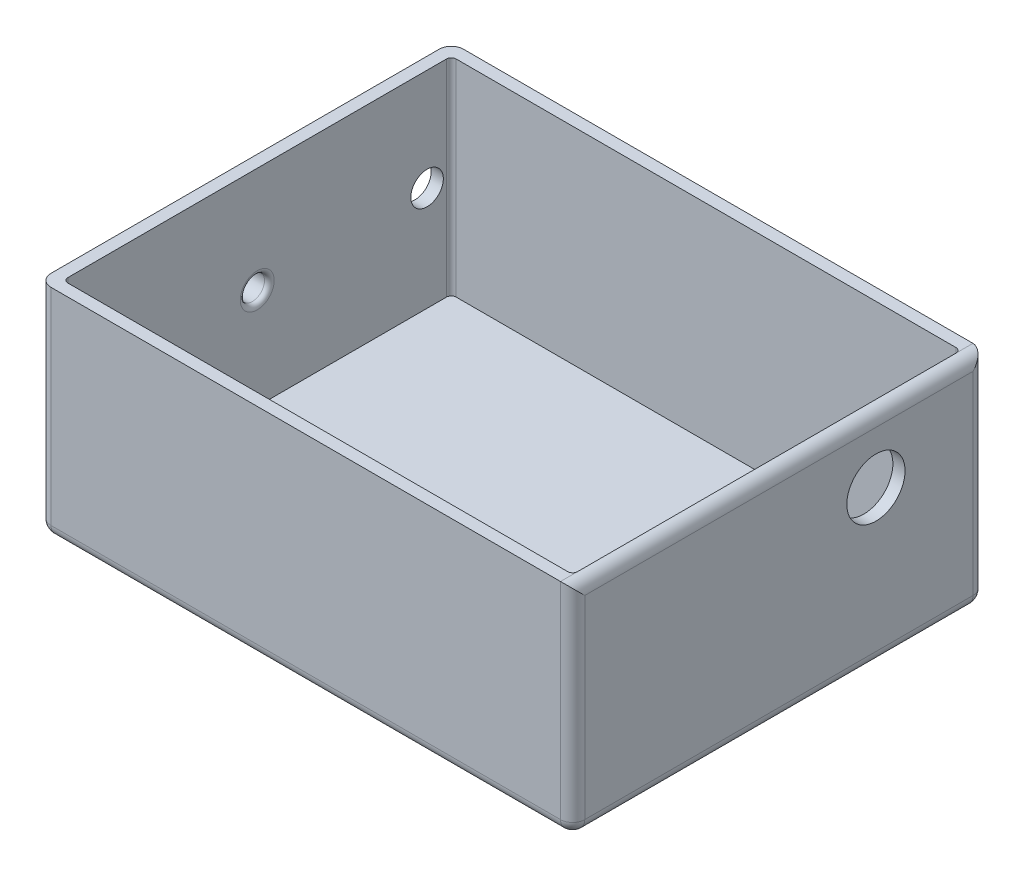
ISO-10303-21;
HEADER;
FILE_DESCRIPTION(('STEP AP214'),'2;1');
FILE_NAME('part.step','',(''),(''),'','','');
FILE_SCHEMA(('AUTOMOTIVE_DESIGN { 1 0 10303 214 1 1 1 1 }'));
ENDSEC;
DATA;
#1=APPLICATION_CONTEXT('core data for automotive mechanical design processes');
#2=APPLICATION_PROTOCOL_DEFINITION('international standard','automotive_design',2000,#1);
#3=PRODUCT_CONTEXT('',#1,'mechanical');
#4=PRODUCT('Part','Part','',(#3));
#5=PRODUCT_RELATED_PRODUCT_CATEGORY('part','',(#4));
#6=PRODUCT_DEFINITION_FORMATION('','',#4);
#7=PRODUCT_DEFINITION_CONTEXT('part definition',#1,'design');
#8=PRODUCT_DEFINITION('design','',#6,#7);
#9=PRODUCT_DEFINITION_SHAPE('','',#8);
#10=(LENGTH_UNIT() NAMED_UNIT(*) SI_UNIT(.MILLI.,.METRE.));
#11=(NAMED_UNIT(*) PLANE_ANGLE_UNIT() SI_UNIT($,.RADIAN.));
#12=(NAMED_UNIT(*) SI_UNIT($,.STERADIAN.) SOLID_ANGLE_UNIT());
#13=UNCERTAINTY_MEASURE_WITH_UNIT(LENGTH_MEASURE(1.E-05),#10,'distance_accuracy_value','');
#14=(GEOMETRIC_REPRESENTATION_CONTEXT(3) GLOBAL_UNCERTAINTY_ASSIGNED_CONTEXT((#13)) GLOBAL_UNIT_ASSIGNED_CONTEXT((#10,
#11,#12)) REPRESENTATION_CONTEXT('',''));
#15=CARTESIAN_POINT('',(0.,0.,0.));
#16=DIRECTION('',(0.,0.,1.));
#17=DIRECTION('',(1.,0.,0.));
#18=AXIS2_PLACEMENT_3D('',#15,#16,#17);
#19=CARTESIAN_POINT('',(55.,45.,42.5));
#20=DIRECTION('',(-1.,0.,0.));
#21=DIRECTION('',(0.,0.,1.));
#22=AXIS2_PLACEMENT_3D('',#19,#20,#21);
#23=PLANE('',#22);
#24=CARTESIAN_POINT('',(55.,31.7655810524085,-20.));
#25=DIRECTION('',(1.,0.,0.));
#26=DIRECTION('',(0.,0.,-1.));
#27=AXIS2_PLACEMENT_3D('',#24,#25,#26);
#28=CIRCLE('',#27,6.);
#29=CARTESIAN_POINT('',(55.,31.7655810524085,-26.));
#30=VERTEX_POINT('',#29);
#31=EDGE_CURVE('E157',#30,#30,#28,.T.);
#32=ORIENTED_EDGE('',*,*,#31,.F.);
#33=EDGE_LOOP('',(#32));
#34=FACE_BOUND('',#33,.T.);
#35=DIRECTION('',(0.,0.,-1.));
#36=VECTOR('',#35,1.);
#37=CARTESIAN_POINT('',(55.,42.5,42.5));
#38=LINE('',#37,#36);
#39=CARTESIAN_POINT('',(55.,42.5,-40.));
#40=VERTEX_POINT('',#39);
#41=CARTESIAN_POINT('',(55.,42.5,40.));
#42=VERTEX_POINT('',#41);
#43=EDGE_CURVE('E205',#40,#42,#38,.F.);
#44=ORIENTED_EDGE('',*,*,#43,.T.);
#45=DIRECTION('',(0.,-1.,0.));
#46=VECTOR('',#45,1.);
#47=CARTESIAN_POINT('',(55.,45.,40.));
#48=LINE('',#47,#46);
#49=CARTESIAN_POINT('',(55.,2.5,40.));
#50=VERTEX_POINT('',#49);
#51=EDGE_CURVE('E208',#42,#50,#48,.T.);
#52=ORIENTED_EDGE('',*,*,#51,.T.);
#53=DIRECTION('',(0.,0.,-1.));
#54=VECTOR('',#53,1.);
#55=CARTESIAN_POINT('',(55.,2.5,-42.5));
#56=LINE('',#55,#54);
#57=CARTESIAN_POINT('',(55.,2.5,-40.));
#58=VERTEX_POINT('',#57);
#59=EDGE_CURVE('E199',#50,#58,#56,.T.);
#60=ORIENTED_EDGE('',*,*,#59,.T.);
#61=DIRECTION('',(0.,-1.,0.));
#62=VECTOR('',#61,1.);
#63=CARTESIAN_POINT('',(55.,45.,-40.));
#64=LINE('',#63,#62);
#65=EDGE_CURVE('E202',#58,#40,#64,.F.);
#66=ORIENTED_EDGE('',*,*,#65,.T.);
#67=EDGE_LOOP('',(#44,#52,#60,#66));
#68=FACE_BOUND('',#67,.T.);
#69=ADVANCED_FACE('F36',(#34,#68),#23,.F.);
#70=CARTESIAN_POINT('',(-55.,45.,-42.5));
#71=DIRECTION('',(0.,0.,1.));
#72=DIRECTION('',(1.,0.,0.));
#73=AXIS2_PLACEMENT_3D('',#70,#71,#72);
#74=PLANE('',#73);
#75=DIRECTION('',(-1.,0.,0.));
#76=VECTOR('',#75,1.);
#77=CARTESIAN_POINT('',(-55.,45.,-42.5));
#78=LINE('',#77,#76);
#79=CARTESIAN_POINT('',(52.5,45.,-42.5));
#80=VERTEX_POINT('',#79);
#81=CARTESIAN_POINT('',(-52.5,45.,-42.5));
#82=VERTEX_POINT('',#81);
#83=EDGE_CURVE('E186',#80,#82,#78,.T.);
#84=ORIENTED_EDGE('',*,*,#83,.F.);
#85=DIRECTION('',(0.,-1.,0.));
#86=VECTOR('',#85,1.);
#87=CARTESIAN_POINT('',(52.5,45.,-42.5));
#88=LINE('',#87,#86);
#89=CARTESIAN_POINT('',(52.5,2.5,-42.5));
#90=VERTEX_POINT('',#89);
#91=EDGE_CURVE('E234',#80,#90,#88,.T.);
#92=ORIENTED_EDGE('',*,*,#91,.T.);
#93=DIRECTION('',(-1.,0.,0.));
#94=VECTOR('',#93,1.);
#95=CARTESIAN_POINT('',(-55.,2.5,-42.5));
#96=LINE('',#95,#94);
#97=CARTESIAN_POINT('',(-52.5,2.5,-42.5));
#98=VERTEX_POINT('',#97);
#99=EDGE_CURVE('E231',#90,#98,#96,.T.);
#100=ORIENTED_EDGE('',*,*,#99,.T.);
#101=DIRECTION('',(0.,-1.,0.));
#102=VECTOR('',#101,1.);
#103=CARTESIAN_POINT('',(-52.5,45.,-42.5));
#104=LINE('',#103,#102);
#105=EDGE_CURVE('E228',#98,#82,#104,.F.);
#106=ORIENTED_EDGE('',*,*,#105,.T.);
#107=EDGE_LOOP('',(#84,#92,#100,#106));
#108=FACE_BOUND('',#107,.T.);
#109=ADVANCED_FACE('F333',(#108),#74,.F.);
#110=CARTESIAN_POINT('',(-55.,45.,42.5));
#111=DIRECTION('',(1.,0.,0.));
#112=DIRECTION('',(0.,0.,-1.));
#113=AXIS2_PLACEMENT_3D('',#110,#111,#112);
#114=PLANE('',#113);
#115=CARTESIAN_POINT('',(-55.,23.9646390651741,-35.));
#116=DIRECTION('',(-1.,0.,0.));
#117=DIRECTION('',(0.,0.,1.));
#118=AXIS2_PLACEMENT_3D('',#115,#116,#117);
#119=CIRCLE('',#118,3.35);
#120=CARTESIAN_POINT('',(-55.,23.9646390651741,-31.65));
#121=VERTEX_POINT('',#120);
#122=EDGE_CURVE('E166',#121,#121,#119,.T.);
#123=ORIENTED_EDGE('',*,*,#122,.F.);
#124=EDGE_LOOP('',(#123));
#125=FACE_BOUND('',#124,.T.);
#126=CARTESIAN_POINT('',(-55.,23.219153855166,0.));
#127=DIRECTION('',(1.,0.,0.));
#128=DIRECTION('',(0.,0.,-1.));
#129=AXIS2_PLACEMENT_3D('',#126,#127,#128);
#130=CIRCLE('',#129,5.9150635094611);
#131=CARTESIAN_POINT('',(-55.,23.219153855166,-5.9150635094611));
#132=VERTEX_POINT('',#131);
#133=EDGE_CURVE('E258',#132,#132,#130,.T.);
#134=ORIENTED_EDGE('',*,*,#133,.T.);
#135=EDGE_LOOP('',(#134));
#136=FACE_BOUND('',#135,.T.);
#137=DIRECTION('',(0.,0.,1.));
#138=VECTOR('',#137,1.);
#139=CARTESIAN_POINT('',(-55.,45.,42.5));
#140=LINE('',#139,#138);
#141=CARTESIAN_POINT('',(-55.,45.,-40.));
#142=VERTEX_POINT('',#141);
#143=CARTESIAN_POINT('',(-55.,45.,40.));
#144=VERTEX_POINT('',#143);
#145=EDGE_CURVE('E194',#142,#144,#140,.T.);
#146=ORIENTED_EDGE('',*,*,#145,.F.);
#147=DIRECTION('',(0.,-1.,0.));
#148=VECTOR('',#147,1.);
#149=CARTESIAN_POINT('',(-55.,45.,-40.));
#150=LINE('',#149,#148);
#151=CARTESIAN_POINT('',(-55.,2.5,-40.));
#152=VERTEX_POINT('',#151);
#153=EDGE_CURVE('E255',#142,#152,#150,.T.);
#154=ORIENTED_EDGE('',*,*,#153,.T.);
#155=DIRECTION('',(0.,0.,1.));
#156=VECTOR('',#155,1.);
#157=CARTESIAN_POINT('',(-55.,2.5,42.5));
#158=LINE('',#157,#156);
#159=CARTESIAN_POINT('',(-55.,2.5,40.));
#160=VERTEX_POINT('',#159);
#161=EDGE_CURVE('E252',#152,#160,#158,.T.);
#162=ORIENTED_EDGE('',*,*,#161,.T.);
#163=DIRECTION('',(0.,-1.,0.));
#164=VECTOR('',#163,1.);
#165=CARTESIAN_POINT('',(-55.,45.,40.));
#166=LINE('',#165,#164);
#167=EDGE_CURVE('E249',#160,#144,#166,.F.);
#168=ORIENTED_EDGE('',*,*,#167,.T.);
#169=EDGE_LOOP('',(#146,#154,#162,#168));
#170=FACE_BOUND('',#169,.T.);
#171=ADVANCED_FACE('F383',(#125,#136,#170),#114,.F.);
#172=CARTESIAN_POINT('',(-55.,45.,42.5));
#173=DIRECTION('',(0.,0.,-1.));
#174=DIRECTION('',(-1.,0.,0.));
#175=AXIS2_PLACEMENT_3D('',#172,#173,#174);
#176=PLANE('',#175);
#177=DIRECTION('',(1.,0.,0.));
#178=VECTOR('',#177,1.);
#179=CARTESIAN_POINT('',(55.,2.5,42.5));
#180=LINE('',#179,#178);
#181=CARTESIAN_POINT('',(-52.5,2.5,42.5));
#182=VERTEX_POINT('',#181);
#183=CARTESIAN_POINT('',(52.5,2.5,42.5));
#184=VERTEX_POINT('',#183);
#185=EDGE_CURVE('E214',#182,#184,#180,.T.);
#186=ORIENTED_EDGE('',*,*,#185,.T.);
#187=DIRECTION('',(0.,-1.,0.));
#188=VECTOR('',#187,1.);
#189=CARTESIAN_POINT('',(52.5,45.,42.5));
#190=LINE('',#189,#188);
#191=CARTESIAN_POINT('',(52.5,45.,42.5));
#192=VERTEX_POINT('',#191);
#193=EDGE_CURVE('E217',#184,#192,#190,.F.);
#194=ORIENTED_EDGE('',*,*,#193,.T.);
#195=DIRECTION('',(1.,0.,0.));
#196=VECTOR('',#195,1.);
#197=CARTESIAN_POINT('',(-55.,45.,42.5));
#198=LINE('',#197,#196);
#199=CARTESIAN_POINT('',(-52.5,45.,42.5));
#200=VERTEX_POINT('',#199);
#201=EDGE_CURVE('E197',#200,#192,#198,.T.);
#202=ORIENTED_EDGE('',*,*,#201,.F.);
#203=DIRECTION('',(0.,-1.,0.));
#204=VECTOR('',#203,1.);
#205=CARTESIAN_POINT('',(-52.5,45.,42.5));
#206=LINE('',#205,#204);
#207=EDGE_CURVE('E211',#200,#182,#206,.T.);
#208=ORIENTED_EDGE('',*,*,#207,.T.);
#209=EDGE_LOOP('',(#186,#194,#202,#208));
#210=FACE_BOUND('',#209,.T.);
#211=ADVANCED_FACE('F408',(#210),#176,.F.);
#212=CARTESIAN_POINT('',(0.,45.,0.));
#213=DIRECTION('',(0.,-1.,0.));
#214=DIRECTION('',(0.,0.,-1.));
#215=AXIS2_PLACEMENT_3D('',#212,#213,#214);
#216=PLANE('',#215);
#217=ORIENTED_EDGE('',*,*,#201,.T.);
#218=DIRECTION('',(0.,0.,-1.));
#219=VECTOR('',#218,1.);
#220=CARTESIAN_POINT('',(52.5,45.,0.));
#221=LINE('',#220,#219);
#222=CARTESIAN_POINT('',(52.5,45.,39.));
#223=VERTEX_POINT('',#222);
#224=EDGE_CURVE('E74',#192,#223,#221,.T.);
#225=ORIENTED_EDGE('',*,*,#224,.T.);
#226=CARTESIAN_POINT('',(51.5,45.,39.));
#227=DIRECTION('',(0.,-1.,0.));
#228=DIRECTION('',(0.,0.,-1.));
#229=AXIS2_PLACEMENT_3D('',#226,#227,#228);
#230=CIRCLE('',#229,1.);
#231=CARTESIAN_POINT('',(51.5,45.,40.));
#232=VERTEX_POINT('',#231);
#233=EDGE_CURVE('E150',#223,#232,#230,.T.);
#234=ORIENTED_EDGE('',*,*,#233,.T.);
#235=DIRECTION('',(1.,0.,0.));
#236=VECTOR('',#235,1.);
#237=CARTESIAN_POINT('',(-52.5,45.,40.));
#238=LINE('',#237,#236);
#239=CARTESIAN_POINT('',(-51.5,45.,40.));
#240=VERTEX_POINT('',#239);
#241=EDGE_CURVE('E178',#240,#232,#238,.T.);
#242=ORIENTED_EDGE('',*,*,#241,.F.);
#243=CARTESIAN_POINT('',(-51.5,45.,39.));
#244=DIRECTION('',(0.,-1.,0.));
#245=DIRECTION('',(0.,0.,-1.));
#246=AXIS2_PLACEMENT_3D('',#243,#244,#245);
#247=CIRCLE('',#246,1.);
#248=CARTESIAN_POINT('',(-52.5,45.,39.));
#249=VERTEX_POINT('',#248);
#250=EDGE_CURVE('E45',#240,#249,#247,.T.);
#251=ORIENTED_EDGE('',*,*,#250,.T.);
#252=DIRECTION('',(0.,0.,1.));
#253=VECTOR('',#252,1.);
#254=CARTESIAN_POINT('',(-52.5,45.,40.));
#255=LINE('',#254,#253);
#256=CARTESIAN_POINT('',(-52.5,45.,-39.));
#257=VERTEX_POINT('',#256);
#258=EDGE_CURVE('E122',#257,#249,#255,.T.);
#259=ORIENTED_EDGE('',*,*,#258,.F.);
#260=CARTESIAN_POINT('',(-51.5,45.,-39.));
#261=DIRECTION('',(0.,-1.,0.));
#262=DIRECTION('',(0.,0.,-1.));
#263=AXIS2_PLACEMENT_3D('',#260,#261,#262);
#264=CIRCLE('',#263,1.);
#265=CARTESIAN_POINT('',(-51.5,45.,-40.));
#266=VERTEX_POINT('',#265);
#267=EDGE_CURVE('E11',#257,#266,#264,.T.);
#268=ORIENTED_EDGE('',*,*,#267,.T.);
#269=DIRECTION('',(-1.,0.,0.));
#270=VECTOR('',#269,1.);
#271=CARTESIAN_POINT('',(-52.5,45.,-40.));
#272=LINE('',#271,#270);
#273=CARTESIAN_POINT('',(51.5,45.,-40.));
#274=VERTEX_POINT('',#273);
#275=EDGE_CURVE('E121',#274,#266,#272,.T.);
#276=ORIENTED_EDGE('',*,*,#275,.F.);
#277=CARTESIAN_POINT('',(51.5,45.,-39.));
#278=DIRECTION('',(0.,-1.,0.));
#279=DIRECTION('',(0.,0.,-1.));
#280=AXIS2_PLACEMENT_3D('',#277,#278,#279);
#281=CIRCLE('',#280,1.);
#282=CARTESIAN_POINT('',(52.5,45.,-39.));
#283=VERTEX_POINT('',#282);
#284=EDGE_CURVE('E152',#274,#283,#281,.T.);
#285=ORIENTED_EDGE('',*,*,#284,.T.);
#286=DIRECTION('',(0.,0.,-1.));
#287=VECTOR('',#286,1.);
#288=CARTESIAN_POINT('',(52.5,45.,0.));
#289=LINE('',#288,#287);
#290=EDGE_CURVE('E53',#283,#80,#289,.T.);
#291=ORIENTED_EDGE('',*,*,#290,.T.);
#292=ORIENTED_EDGE('',*,*,#83,.T.);
#293=CARTESIAN_POINT('',(-52.5,45.,-40.));
#294=DIRECTION('',(0.,-1.,0.));
#295=DIRECTION('',(0.,0.,-1.));
#296=AXIS2_PLACEMENT_3D('',#293,#294,#295);
#297=CIRCLE('',#296,2.5);
#298=EDGE_CURVE('E223',#82,#142,#297,.F.);
#299=ORIENTED_EDGE('',*,*,#298,.T.);
#300=ORIENTED_EDGE('',*,*,#145,.T.);
#301=CARTESIAN_POINT('',(-52.5,45.,40.));
#302=DIRECTION('',(0.,-1.,0.));
#303=DIRECTION('',(0.,0.,-1.));
#304=AXIS2_PLACEMENT_3D('',#301,#302,#303);
#305=CIRCLE('',#304,2.5);
#306=EDGE_CURVE('E220',#144,#200,#305,.F.);
#307=ORIENTED_EDGE('',*,*,#306,.T.);
#308=EDGE_LOOP('',(#217,#225,#234,#242,#251,#259,#268,#276,#285,#291,#292,#299,#300,#307));
#309=FACE_BOUND('',#308,.T.);
#310=ADVANCED_FACE('F119',(#309),#216,.F.);
#311=CARTESIAN_POINT('',(0.,0.,0.));
#312=DIRECTION('',(0.,-1.,0.));
#313=DIRECTION('',(0.,0.,-1.));
#314=AXIS2_PLACEMENT_3D('',#311,#312,#313);
#315=PLANE('',#314);
#316=DIRECTION('',(0.,0.,1.));
#317=VECTOR('',#316,1.);
#318=CARTESIAN_POINT('',(-52.5,0.,-42.5));
#319=LINE('',#318,#317);
#320=CARTESIAN_POINT('',(-52.5,0.,40.));
#321=VERTEX_POINT('',#320);
#322=CARTESIAN_POINT('',(-52.5,0.,-40.));
#323=VERTEX_POINT('',#322);
#324=EDGE_CURVE('E240',#321,#323,#319,.F.);
#325=ORIENTED_EDGE('',*,*,#324,.T.);
#326=DIRECTION('',(-1.,0.,0.));
#327=VECTOR('',#326,1.);
#328=CARTESIAN_POINT('',(55.,0.,-40.));
#329=LINE('',#328,#327);
#330=CARTESIAN_POINT('',(52.5,0.,-40.));
#331=VERTEX_POINT('',#330);
#332=EDGE_CURVE('E246',#323,#331,#329,.F.);
#333=ORIENTED_EDGE('',*,*,#332,.T.);
#334=DIRECTION('',(0.,0.,-1.));
#335=VECTOR('',#334,1.);
#336=CARTESIAN_POINT('',(52.5,0.,42.5));
#337=LINE('',#336,#335);
#338=CARTESIAN_POINT('',(52.5,0.,40.));
#339=VERTEX_POINT('',#338);
#340=EDGE_CURVE('E243',#331,#339,#337,.F.);
#341=ORIENTED_EDGE('',*,*,#340,.T.);
#342=DIRECTION('',(1.,0.,0.));
#343=VECTOR('',#342,1.);
#344=CARTESIAN_POINT('',(-55.,0.,40.));
#345=LINE('',#344,#343);
#346=EDGE_CURVE('E237',#339,#321,#345,.F.);
#347=ORIENTED_EDGE('',*,*,#346,.T.);
#348=EDGE_LOOP('',(#325,#333,#341,#347));
#349=FACE_BOUND('',#348,.T.);
#350=ADVANCED_FACE('F430',(#349),#315,.T.);
#351=CARTESIAN_POINT('',(52.5,2.5,40.));
#352=DIRECTION('',(1.,0.,0.));
#353=DIRECTION('',(0.,0.,-1.));
#354=AXIS2_PLACEMENT_3D('',#351,#352,#353);
#355=PLANE('',#354);
#356=CARTESIAN_POINT('',(52.5,31.7655810524085,-20.));
#357=DIRECTION('',(1.,0.,0.));
#358=DIRECTION('',(0.,0.,-1.));
#359=AXIS2_PLACEMENT_3D('',#356,#357,#358);
#360=CIRCLE('',#359,6.);
#361=CARTESIAN_POINT('',(52.5,31.7655810524085,-26.));
#362=VERTEX_POINT('',#361);
#363=EDGE_CURVE('E154',#362,#362,#360,.T.);
#364=ORIENTED_EDGE('',*,*,#363,.T.);
#365=EDGE_LOOP('',(#364));
#366=FACE_BOUND('',#365,.T.);
#367=DIRECTION('',(0.,0.,-1.));
#368=VECTOR('',#367,1.);
#369=CARTESIAN_POINT('',(52.5,2.5,40.));
#370=LINE('',#369,#368);
#371=CARTESIAN_POINT('',(52.5,2.5,39.));
#372=VERTEX_POINT('',#371);
#373=CARTESIAN_POINT('',(52.5,2.5,-39.));
#374=VERTEX_POINT('',#373);
#375=EDGE_CURVE('E174',#372,#374,#370,.T.);
#376=ORIENTED_EDGE('',*,*,#375,.F.);
#377=DIRECTION('',(0.,1.,0.));
#378=VECTOR('',#377,1.);
#379=CARTESIAN_POINT('',(52.5,45.,39.));
#380=LINE('',#379,#378);
#381=EDGE_CURVE('E308',#372,#223,#380,.T.);
#382=ORIENTED_EDGE('',*,*,#381,.T.);
#383=DIRECTION('',(0.,0.,-1.));
#384=VECTOR('',#383,1.);
#385=CARTESIAN_POINT('',(52.5,45.,40.));
#386=LINE('',#385,#384);
#387=EDGE_CURVE('E135',#223,#283,#386,.T.);
#388=ORIENTED_EDGE('',*,*,#387,.T.);
#389=DIRECTION('',(0.,1.,0.));
#390=VECTOR('',#389,1.);
#391=CARTESIAN_POINT('',(52.5,2.5,-39.));
#392=LINE('',#391,#390);
#393=EDGE_CURVE('E306',#283,#374,#392,.F.);
#394=ORIENTED_EDGE('',*,*,#393,.T.);
#395=EDGE_LOOP('',(#376,#382,#388,#394));
#396=FACE_BOUND('',#395,.T.);
#397=ADVANCED_FACE('F585',(#366,#396),#355,.F.);
#398=CARTESIAN_POINT('',(-52.5,2.5,40.));
#399=DIRECTION('',(0.,0.,1.));
#400=DIRECTION('',(1.,0.,0.));
#401=AXIS2_PLACEMENT_3D('',#398,#399,#400);
#402=PLANE('',#401);
#403=ORIENTED_EDGE('',*,*,#241,.T.);
#404=DIRECTION('',(0.,1.,0.));
#405=VECTOR('',#404,1.);
#406=CARTESIAN_POINT('',(51.5,2.5,40.));
#407=LINE('',#406,#405);
#408=CARTESIAN_POINT('',(51.5,2.5,40.));
#409=VERTEX_POINT('',#408);
#410=EDGE_CURVE('E314',#232,#409,#407,.F.);
#411=ORIENTED_EDGE('',*,*,#410,.T.);
#412=DIRECTION('',(1.,0.,0.));
#413=VECTOR('',#412,1.);
#414=CARTESIAN_POINT('',(-52.5,2.5,40.));
#415=LINE('',#414,#413);
#416=CARTESIAN_POINT('',(-51.5,2.5,40.));
#417=VERTEX_POINT('',#416);
#418=EDGE_CURVE('E183',#417,#409,#415,.T.);
#419=ORIENTED_EDGE('',*,*,#418,.F.);
#420=DIRECTION('',(0.,1.,0.));
#421=VECTOR('',#420,1.);
#422=CARTESIAN_POINT('',(-51.5,45.,40.));
#423=LINE('',#422,#421);
#424=EDGE_CURVE('E311',#417,#240,#423,.T.);
#425=ORIENTED_EDGE('',*,*,#424,.T.);
#426=EDGE_LOOP('',(#403,#411,#419,#425));
#427=FACE_BOUND('',#426,.T.);
#428=ADVANCED_FACE('F547',(#427),#402,.F.);
#429=CARTESIAN_POINT('',(-52.5,2.5,40.));
#430=DIRECTION('',(-1.,0.,0.));
#431=DIRECTION('',(0.,0.,1.));
#432=AXIS2_PLACEMENT_3D('',#429,#430,#431);
#433=PLANE('',#432);
#434=CARTESIAN_POINT('',(-52.5,23.9646390651741,-35.));
#435=DIRECTION('',(-1.,0.,0.));
#436=DIRECTION('',(0.,0.,1.));
#437=AXIS2_PLACEMENT_3D('',#434,#435,#436);
#438=CIRCLE('',#437,3.35);
#439=CARTESIAN_POINT('',(-52.5,23.9646390651741,-31.65));
#440=VERTEX_POINT('',#439);
#441=EDGE_CURVE('E40',#440,#440,#438,.T.);
#442=ORIENTED_EDGE('',*,*,#441,.T.);
#443=EDGE_LOOP('',(#442));
#444=FACE_BOUND('',#443,.T.);
#445=CARTESIAN_POINT('',(-52.5,23.219153855166,0.));
#446=DIRECTION('',(-1.,0.,0.));
#447=DIRECTION('',(0.,0.,1.));
#448=AXIS2_PLACEMENT_3D('',#445,#446,#447);
#449=CIRCLE('',#448,3.5);
#450=CARTESIAN_POINT('',(-52.5,23.219153855166,3.5));
#451=VERTEX_POINT('',#450);
#452=EDGE_CURVE('E300',#451,#451,#449,.T.);
#453=ORIENTED_EDGE('',*,*,#452,.T.);
#454=EDGE_LOOP('',(#453));
#455=FACE_BOUND('',#454,.T.);
#456=ORIENTED_EDGE('',*,*,#258,.T.);
#457=DIRECTION('',(0.,1.,0.));
#458=VECTOR('',#457,1.);
#459=CARTESIAN_POINT('',(-52.5,2.5,39.));
#460=LINE('',#459,#458);
#461=CARTESIAN_POINT('',(-52.5,2.5,39.));
#462=VERTEX_POINT('',#461);
#463=EDGE_CURVE('E148',#249,#462,#460,.F.);
#464=ORIENTED_EDGE('',*,*,#463,.T.);
#465=DIRECTION('',(0.,0.,1.));
#466=VECTOR('',#465,1.);
#467=CARTESIAN_POINT('',(-52.5,2.5,40.));
#468=LINE('',#467,#466);
#469=CARTESIAN_POINT('',(-52.5,2.5,-39.));
#470=VERTEX_POINT('',#469);
#471=EDGE_CURVE('E180',#470,#462,#468,.T.);
#472=ORIENTED_EDGE('',*,*,#471,.F.);
#473=DIRECTION('',(0.,1.,0.));
#474=VECTOR('',#473,1.);
#475=CARTESIAN_POINT('',(-52.5,45.,-39.));
#476=LINE('',#475,#474);
#477=EDGE_CURVE('E141',#470,#257,#476,.T.);
#478=ORIENTED_EDGE('',*,*,#477,.T.);
#479=EDGE_LOOP('',(#456,#464,#472,#478));
#480=FACE_BOUND('',#479,.T.);
#481=ADVANCED_FACE('F543',(#444,#455,#480),#433,.F.);
#482=CARTESIAN_POINT('',(-52.5,2.5,-40.));
#483=DIRECTION('',(0.,0.,-1.));
#484=DIRECTION('',(-1.,0.,0.));
#485=AXIS2_PLACEMENT_3D('',#482,#483,#484);
#486=PLANE('',#485);
#487=DIRECTION('',(-1.,0.,0.));
#488=VECTOR('',#487,1.);
#489=CARTESIAN_POINT('',(-52.5,2.5,-40.));
#490=LINE('',#489,#488);
#491=CARTESIAN_POINT('',(51.5,2.5,-40.));
#492=VERTEX_POINT('',#491);
#493=CARTESIAN_POINT('',(-51.5,2.5,-40.));
#494=VERTEX_POINT('',#493);
#495=EDGE_CURVE('E177',#492,#494,#490,.T.);
#496=ORIENTED_EDGE('',*,*,#495,.F.);
#497=DIRECTION('',(0.,1.,0.));
#498=VECTOR('',#497,1.);
#499=CARTESIAN_POINT('',(51.5,45.,-40.));
#500=LINE('',#499,#498);
#501=EDGE_CURVE('E134',#492,#274,#500,.T.);
#502=ORIENTED_EDGE('',*,*,#501,.T.);
#503=ORIENTED_EDGE('',*,*,#275,.T.);
#504=DIRECTION('',(0.,1.,0.));
#505=VECTOR('',#504,1.);
#506=CARTESIAN_POINT('',(-51.5,2.5,-40.));
#507=LINE('',#506,#505);
#508=EDGE_CURVE('E131',#266,#494,#507,.F.);
#509=ORIENTED_EDGE('',*,*,#508,.T.);
#510=EDGE_LOOP('',(#496,#502,#503,#509));
#511=FACE_BOUND('',#510,.T.);
#512=ADVANCED_FACE('F130',(#511),#486,.F.);
#513=CARTESIAN_POINT('',(0.,2.5,0.));
#514=DIRECTION('',(0.,-1.,0.));
#515=DIRECTION('',(0.,0.,-1.));
#516=AXIS2_PLACEMENT_3D('',#513,#514,#515);
#517=PLANE('',#516);
#518=ORIENTED_EDGE('',*,*,#418,.T.);
#519=CARTESIAN_POINT('',(51.5,2.5,39.));
#520=DIRECTION('',(0.,-1.,0.));
#521=DIRECTION('',(0.,0.,-1.));
#522=AXIS2_PLACEMENT_3D('',#519,#520,#521);
#523=CIRCLE('',#522,1.);
#524=EDGE_CURVE('E139',#409,#372,#523,.F.);
#525=ORIENTED_EDGE('',*,*,#524,.T.);
#526=ORIENTED_EDGE('',*,*,#375,.T.);
#527=CARTESIAN_POINT('',(51.5,2.5,-39.));
#528=DIRECTION('',(0.,-1.,0.));
#529=DIRECTION('',(0.,0.,-1.));
#530=AXIS2_PLACEMENT_3D('',#527,#528,#529);
#531=CIRCLE('',#530,1.);
#532=EDGE_CURVE('E143',#374,#492,#531,.F.);
#533=ORIENTED_EDGE('',*,*,#532,.T.);
#534=ORIENTED_EDGE('',*,*,#495,.T.);
#535=CARTESIAN_POINT('',(-51.5,2.5,-39.));
#536=DIRECTION('',(0.,-1.,0.));
#537=DIRECTION('',(0.,0.,-1.));
#538=AXIS2_PLACEMENT_3D('',#535,#536,#537);
#539=CIRCLE('',#538,1.);
#540=EDGE_CURVE('E138',#494,#470,#539,.F.);
#541=ORIENTED_EDGE('',*,*,#540,.T.);
#542=ORIENTED_EDGE('',*,*,#471,.T.);
#543=CARTESIAN_POINT('',(-51.5,2.5,39.));
#544=DIRECTION('',(0.,-1.,0.));
#545=DIRECTION('',(0.,0.,-1.));
#546=AXIS2_PLACEMENT_3D('',#543,#544,#545);
#547=CIRCLE('',#546,1.);
#548=EDGE_CURVE('E317',#462,#417,#547,.F.);
#549=ORIENTED_EDGE('',*,*,#548,.T.);
#550=EDGE_LOOP('',(#518,#525,#526,#533,#534,#541,#542,#549));
#551=FACE_BOUND('',#550,.T.);
#552=ADVANCED_FACE('F320',(#551),#517,.F.);
#553=CARTESIAN_POINT('',(-52.5,45.,-40.));
#554=DIRECTION('',(0.,-1.,0.));
#555=DIRECTION('',(0.,0.,-1.));
#556=AXIS2_PLACEMENT_3D('',#553,#554,#555);
#557=CYLINDRICAL_SURFACE('',#556,2.5);
#558=CARTESIAN_POINT('',(-52.5,2.5,-40.));
#559=DIRECTION('',(0.,-1.,0.));
#560=DIRECTION('',(0.,0.,-1.));
#561=AXIS2_PLACEMENT_3D('',#558,#559,#560);
#562=CIRCLE('',#561,2.5);
#563=EDGE_CURVE('E187',#152,#98,#562,.T.);
#564=ORIENTED_EDGE('',*,*,#563,.F.);
#565=ORIENTED_EDGE('',*,*,#153,.F.);
#566=ORIENTED_EDGE('',*,*,#298,.F.);
#567=ORIENTED_EDGE('',*,*,#105,.F.);
#568=EDGE_LOOP('',(#564,#565,#566,#567));
#569=FACE_BOUND('',#568,.T.);
#570=ADVANCED_FACE('F388',(#569),#557,.T.);
#571=CARTESIAN_POINT('',(-52.5,2.5,-40.));
#572=DIRECTION('',(0.,0.,-1.));
#573=DIRECTION('',(0.,1.,0.));
#574=AXIS2_PLACEMENT_3D('',#571,#572,#573);
#575=SPHERICAL_SURFACE('',#574,2.5);
#576=CARTESIAN_POINT('',(-52.5,2.5,-40.));
#577=DIRECTION('',(0.,0.,-1.));
#578=DIRECTION('',(-1.,0.,0.));
#579=AXIS2_PLACEMENT_3D('',#576,#577,#578);
#580=CIRCLE('',#579,2.5);
#581=EDGE_CURVE('E290',#152,#323,#580,.F.);
#582=ORIENTED_EDGE('',*,*,#581,.F.);
#583=ORIENTED_EDGE('',*,*,#563,.T.);
#584=CARTESIAN_POINT('',(-52.5,2.5,-40.));
#585=DIRECTION('',(-1.,0.,0.));
#586=DIRECTION('',(0.,0.,1.));
#587=AXIS2_PLACEMENT_3D('',#584,#585,#586);
#588=CIRCLE('',#587,2.5);
#589=EDGE_CURVE('E293',#323,#98,#588,.F.);
#590=ORIENTED_EDGE('',*,*,#589,.F.);
#591=EDGE_LOOP('',(#582,#583,#590));
#592=FACE_BOUND('',#591,.T.);
#593=ADVANCED_FACE('F391',(#592),#575,.T.);
#594=CARTESIAN_POINT('',(-55.,2.5,-40.));
#595=DIRECTION('',(1.,0.,0.));
#596=DIRECTION('',(0.,0.,-1.));
#597=AXIS2_PLACEMENT_3D('',#594,#595,#596);
#598=CYLINDRICAL_SURFACE('',#597,2.5);
#599=ORIENTED_EDGE('',*,*,#589,.T.);
#600=ORIENTED_EDGE('',*,*,#99,.F.);
#601=CARTESIAN_POINT('',(52.5,2.5,-40.));
#602=DIRECTION('',(1.,0.,0.));
#603=DIRECTION('',(0.,0.,-1.));
#604=AXIS2_PLACEMENT_3D('',#601,#602,#603);
#605=CIRCLE('',#604,2.5);
#606=EDGE_CURVE('E287',#331,#90,#605,.T.);
#607=ORIENTED_EDGE('',*,*,#606,.F.);
#608=ORIENTED_EDGE('',*,*,#332,.F.);
#609=EDGE_LOOP('',(#599,#600,#607,#608));
#610=FACE_BOUND('',#609,.T.);
#611=ADVANCED_FACE('F428',(#610),#598,.T.);
#612=CARTESIAN_POINT('',(-52.5,2.5,42.5));
#613=DIRECTION('',(0.,0.,-1.));
#614=DIRECTION('',(-1.,0.,0.));
#615=AXIS2_PLACEMENT_3D('',#612,#613,#614);
#616=CYLINDRICAL_SURFACE('',#615,2.5);
#617=ORIENTED_EDGE('',*,*,#581,.T.);
#618=ORIENTED_EDGE('',*,*,#324,.F.);
#619=CARTESIAN_POINT('',(-52.5,2.5,40.));
#620=DIRECTION('',(0.,0.,1.));
#621=DIRECTION('',(1.,0.,0.));
#622=AXIS2_PLACEMENT_3D('',#619,#620,#621);
#623=CIRCLE('',#622,2.5);
#624=EDGE_CURVE('E284',#160,#321,#623,.T.);
#625=ORIENTED_EDGE('',*,*,#624,.F.);
#626=ORIENTED_EDGE('',*,*,#161,.F.);
#627=EDGE_LOOP('',(#617,#618,#625,#626));
#628=FACE_BOUND('',#627,.T.);
#629=ADVANCED_FACE('F396',(#628),#616,.T.);
#630=CARTESIAN_POINT('',(-52.5,45.,40.));
#631=DIRECTION('',(0.,-1.,0.));
#632=DIRECTION('',(0.,0.,-1.));
#633=AXIS2_PLACEMENT_3D('',#630,#631,#632);
#634=CYLINDRICAL_SURFACE('',#633,2.5);
#635=ORIENTED_EDGE('',*,*,#306,.F.);
#636=ORIENTED_EDGE('',*,*,#167,.F.);
#637=CARTESIAN_POINT('',(-52.5,2.5,40.));
#638=DIRECTION('',(0.,-1.,0.));
#639=DIRECTION('',(0.,0.,-1.));
#640=AXIS2_PLACEMENT_3D('',#637,#638,#639);
#641=CIRCLE('',#640,2.5);
#642=EDGE_CURVE('E281',#182,#160,#641,.T.);
#643=ORIENTED_EDGE('',*,*,#642,.F.);
#644=ORIENTED_EDGE('',*,*,#207,.F.);
#645=EDGE_LOOP('',(#635,#636,#643,#644));
#646=FACE_BOUND('',#645,.T.);
#647=ADVANCED_FACE('F405',(#646),#634,.T.);
#648=CARTESIAN_POINT('',(52.5,2.5,-40.));
#649=DIRECTION('',(0.,0.,-1.));
#650=DIRECTION('',(0.,1.,0.));
#651=AXIS2_PLACEMENT_3D('',#648,#649,#650);
#652=SPHERICAL_SURFACE('',#651,2.5);
#653=CARTESIAN_POINT('',(52.5,2.5,-40.));
#654=DIRECTION('',(0.,0.,-1.));
#655=DIRECTION('',(-1.,0.,0.));
#656=AXIS2_PLACEMENT_3D('',#653,#654,#655);
#657=CIRCLE('',#656,2.5);
#658=EDGE_CURVE('E275',#331,#58,#657,.F.);
#659=ORIENTED_EDGE('',*,*,#658,.F.);
#660=ORIENTED_EDGE('',*,*,#606,.T.);
#661=CARTESIAN_POINT('',(52.5,2.5,-40.));
#662=DIRECTION('',(0.,-1.,0.));
#663=DIRECTION('',(0.,0.,-1.));
#664=AXIS2_PLACEMENT_3D('',#661,#662,#663);
#665=CIRCLE('',#664,2.5);
#666=EDGE_CURVE('E278',#58,#90,#665,.F.);
#667=ORIENTED_EDGE('',*,*,#666,.F.);
#668=EDGE_LOOP('',(#659,#660,#667));
#669=FACE_BOUND('',#668,.T.);
#670=ADVANCED_FACE('F425',(#669),#652,.T.);
#671=CARTESIAN_POINT('',(-52.5,2.5,40.));
#672=DIRECTION('',(-1.,0.,0.));
#673=DIRECTION('',(0.,-1.,0.));
#674=AXIS2_PLACEMENT_3D('',#671,#672,#673);
#675=SPHERICAL_SURFACE('',#674,2.5);
#676=ORIENTED_EDGE('',*,*,#642,.T.);
#677=ORIENTED_EDGE('',*,*,#624,.T.);
#678=CARTESIAN_POINT('',(-52.5,2.5,40.));
#679=DIRECTION('',(-1.,0.,0.));
#680=DIRECTION('',(0.,0.,1.));
#681=AXIS2_PLACEMENT_3D('',#678,#679,#680);
#682=CIRCLE('',#681,2.5);
#683=EDGE_CURVE('E272',#182,#321,#682,.F.);
#684=ORIENTED_EDGE('',*,*,#683,.F.);
#685=EDGE_LOOP('',(#676,#677,#684));
#686=FACE_BOUND('',#685,.T.);
#687=ADVANCED_FACE('F400',(#686),#675,.T.);
#688=CARTESIAN_POINT('',(52.5,45.,-40.));
#689=DIRECTION('',(0.,-1.,0.));
#690=DIRECTION('',(0.,0.,-1.));
#691=AXIS2_PLACEMENT_3D('',#688,#689,#690);
#692=CYLINDRICAL_SURFACE('',#691,2.5);
#693=ORIENTED_EDGE('',*,*,#666,.T.);
#694=ORIENTED_EDGE('',*,*,#91,.F.);
#695=CARTESIAN_POINT('',(52.5,42.5,-40.));
#696=DIRECTION('',(0.,-0.707106781186547,-0.707106781186547));
#697=DIRECTION('',(0.,-0.707106781186547,0.707106781186547));
#698=AXIS2_PLACEMENT_3D('',#695,#696,#697);
#699=ELLIPSE('',#698,3.53553390593274,2.5);
#700=EDGE_CURVE('E270',#40,#80,#699,.F.);
#701=ORIENTED_EDGE('',*,*,#700,.F.);
#702=ORIENTED_EDGE('',*,*,#65,.F.);
#703=EDGE_LOOP('',(#693,#694,#701,#702));
#704=FACE_BOUND('',#703,.T.);
#705=ADVANCED_FACE('F339',(#704),#692,.T.);
#706=CARTESIAN_POINT('',(52.5,2.5,42.5));
#707=DIRECTION('',(0.,0.,1.));
#708=DIRECTION('',(1.,0.,0.));
#709=AXIS2_PLACEMENT_3D('',#706,#707,#708);
#710=CYLINDRICAL_SURFACE('',#709,2.5);
#711=ORIENTED_EDGE('',*,*,#658,.T.);
#712=ORIENTED_EDGE('',*,*,#59,.F.);
#713=CARTESIAN_POINT('',(52.5,2.5,40.));
#714=DIRECTION('',(0.,0.,1.));
#715=DIRECTION('',(1.,0.,0.));
#716=AXIS2_PLACEMENT_3D('',#713,#714,#715);
#717=CIRCLE('',#716,2.5);
#718=EDGE_CURVE('E267',#339,#50,#717,.T.);
#719=ORIENTED_EDGE('',*,*,#718,.F.);
#720=ORIENTED_EDGE('',*,*,#340,.F.);
#721=EDGE_LOOP('',(#711,#712,#719,#720));
#722=FACE_BOUND('',#721,.T.);
#723=ADVANCED_FACE('F422',(#722),#710,.T.);
#724=CARTESIAN_POINT('',(-55.,2.5,40.));
#725=DIRECTION('',(-1.,0.,0.));
#726=DIRECTION('',(0.,0.,1.));
#727=AXIS2_PLACEMENT_3D('',#724,#725,#726);
#728=CYLINDRICAL_SURFACE('',#727,2.5);
#729=ORIENTED_EDGE('',*,*,#683,.T.);
#730=ORIENTED_EDGE('',*,*,#346,.F.);
#731=CARTESIAN_POINT('',(52.5,2.5,40.));
#732=DIRECTION('',(1.,0.,0.));
#733=DIRECTION('',(0.,0.,-1.));
#734=AXIS2_PLACEMENT_3D('',#731,#732,#733);
#735=CIRCLE('',#734,2.5);
#736=EDGE_CURVE('E264',#184,#339,#735,.T.);
#737=ORIENTED_EDGE('',*,*,#736,.F.);
#738=ORIENTED_EDGE('',*,*,#185,.F.);
#739=EDGE_LOOP('',(#729,#730,#737,#738));
#740=FACE_BOUND('',#739,.T.);
#741=ADVANCED_FACE('F432',(#740),#728,.T.);
#742=CARTESIAN_POINT('',(52.5,42.5,0.));
#743=DIRECTION('',(0.,0.,-1.));
#744=DIRECTION('',(-1.,0.,0.));
#745=AXIS2_PLACEMENT_3D('',#742,#743,#744);
#746=CYLINDRICAL_SURFACE('',#745,2.5);
#747=ORIENTED_EDGE('',*,*,#387,.F.);
#748=ORIENTED_EDGE('',*,*,#224,.F.);
#749=CARTESIAN_POINT('',(52.5,42.5,40.));
#750=DIRECTION('',(0.,0.707106781186547,-0.707106781186547));
#751=DIRECTION('',(0.,-0.707106781186547,-0.707106781186547));
#752=AXIS2_PLACEMENT_3D('',#749,#750,#751);
#753=ELLIPSE('',#752,3.53553390593274,2.5);
#754=EDGE_CURVE('E261',#42,#192,#753,.F.);
#755=ORIENTED_EDGE('',*,*,#754,.F.);
#756=ORIENTED_EDGE('',*,*,#43,.F.);
#757=ORIENTED_EDGE('',*,*,#700,.T.);
#758=ORIENTED_EDGE('',*,*,#290,.F.);
#759=EDGE_LOOP('',(#747,#748,#755,#756,#757,#758));
#760=FACE_BOUND('',#759,.T.);
#761=ADVANCED_FACE('F344',(#760),#746,.T.);
#762=CARTESIAN_POINT('',(52.5,2.5,40.));
#763=DIRECTION('',(0.,-1.,0.));
#764=DIRECTION('',(0.,0.,-1.));
#765=AXIS2_PLACEMENT_3D('',#762,#763,#764);
#766=SPHERICAL_SURFACE('',#765,2.5);
#767=ORIENTED_EDGE('',*,*,#736,.T.);
#768=ORIENTED_EDGE('',*,*,#718,.T.);
#769=CARTESIAN_POINT('',(52.5,2.5,40.));
#770=DIRECTION('',(0.,-1.,0.));
#771=DIRECTION('',(0.,0.,-1.));
#772=AXIS2_PLACEMENT_3D('',#769,#770,#771);
#773=CIRCLE('',#772,2.5);
#774=EDGE_CURVE('E173',#184,#50,#773,.F.);
#775=ORIENTED_EDGE('',*,*,#774,.F.);
#776=EDGE_LOOP('',(#767,#768,#775));
#777=FACE_BOUND('',#776,.T.);
#778=ADVANCED_FACE('F415',(#777),#766,.T.);
#779=CARTESIAN_POINT('',(52.5,45.,40.));
#780=DIRECTION('',(0.,-1.,0.));
#781=DIRECTION('',(0.,0.,-1.));
#782=AXIS2_PLACEMENT_3D('',#779,#780,#781);
#783=CYLINDRICAL_SURFACE('',#782,2.5);
#784=ORIENTED_EDGE('',*,*,#754,.T.);
#785=ORIENTED_EDGE('',*,*,#193,.F.);
#786=ORIENTED_EDGE('',*,*,#774,.T.);
#787=ORIENTED_EDGE('',*,*,#51,.F.);
#788=EDGE_LOOP('',(#784,#785,#786,#787));
#789=FACE_BOUND('',#788,.T.);
#790=ADVANCED_FACE('F413',(#789),#783,.T.);
#791=CARTESIAN_POINT('',(-27.5,23.219153855166,0.));
#792=DIRECTION('',(-1.,0.,0.));
#793=DIRECTION('',(0.,0.,1.));
#794=AXIS2_PLACEMENT_3D('',#791,#792,#793);
#795=CYLINDRICAL_SURFACE('',#794,2.5);
#796=CARTESIAN_POINT('',(-53.5,23.219153855166,0.));
#797=DIRECTION('',(-1.,0.,0.));
#798=DIRECTION('',(0.,0.,1.));
#799=AXIS2_PLACEMENT_3D('',#796,#797,#798);
#800=CIRCLE('',#799,2.5);
#801=CARTESIAN_POINT('',(-53.5,23.219153855166,2.5));
#802=VERTEX_POINT('',#801);
#803=EDGE_CURVE('E303',#802,#802,#800,.F.);
#804=ORIENTED_EDGE('',*,*,#803,.T.);
#805=EDGE_LOOP('',(#804));
#806=FACE_BOUND('',#805,.T.);
#807=CARTESIAN_POINT('',(-57.5,23.219153855166,0.));
#808=DIRECTION('',(-1.,0.,0.));
#809=DIRECTION('',(0.,0.,1.));
#810=AXIS2_PLACEMENT_3D('',#807,#808,#809);
#811=CIRCLE('',#810,2.5);
#812=CARTESIAN_POINT('',(-57.5,23.219153855166,2.5));
#813=VERTEX_POINT('',#812);
#814=EDGE_CURVE('E170',#813,#813,#811,.T.);
#815=ORIENTED_EDGE('',*,*,#814,.T.);
#816=EDGE_LOOP('',(#815));
#817=FACE_BOUND('',#816,.T.);
#818=ADVANCED_FACE('F452',(#806,#817),#795,.F.);
#819=CARTESIAN_POINT('',(-57.5,23.219153855166,0.));
#820=DIRECTION('',(-1.,0.,0.));
#821=DIRECTION('',(0.,0.,1.));
#822=AXIS2_PLACEMENT_3D('',#819,#820,#821);
#823=TOROIDAL_SURFACE('',#822,3.75,1.25);
#824=CARTESIAN_POINT('',(-57.5,23.219153855166,3.75));
#825=DIRECTION('',(0.,1.,0.));
#826=DIRECTION('',(0.,0.,1.));
#827=AXIS2_PLACEMENT_3D('',#824,#825,#826);
#828=CIRCLE('',#827,1.25);
#829=CARTESIAN_POINT('',(-56.25,23.219153855166,3.75));
#830=VERTEX_POINT('',#829);
#831=EDGE_CURVE('E156',#830,#813,#828,.T.);
#832=ORIENTED_EDGE('',*,*,#831,.T.);
#833=ORIENTED_EDGE('',*,*,#814,.F.);
#834=ORIENTED_EDGE('',*,*,#831,.F.);
#835=CARTESIAN_POINT('',(-56.25,23.219153855166,0.));
#836=DIRECTION('',(-1.,0.,0.));
#837=DIRECTION('',(0.,0.,1.));
#838=AXIS2_PLACEMENT_3D('',#835,#836,#837);
#839=CIRCLE('',#838,3.75);
#840=EDGE_CURVE('E84',#830,#830,#839,.F.);
#841=ORIENTED_EDGE('',*,*,#840,.F.);
#842=EDGE_LOOP('',(#832,#833,#834,#841));
#843=FACE_BOUND('',#842,.T.);
#844=ADVANCED_FACE('F469',(#843),#823,.F.);
#845=CARTESIAN_POINT('',(-57.5,23.219153855166,0.));
#846=DIRECTION('',(1.,0.,0.));
#847=DIRECTION('',(0.,0.,-1.));
#848=AXIS2_PLACEMENT_3D('',#845,#846,#847);
#849=TOROIDAL_SURFACE('',#848,5.9150635094611,2.5);
#850=ORIENTED_EDGE('',*,*,#133,.F.);
#851=EDGE_LOOP('',(#850));
#852=FACE_BOUND('',#851,.T.);
#853=ORIENTED_EDGE('',*,*,#840,.T.);
#854=EDGE_LOOP('',(#853));
#855=FACE_BOUND('',#854,.T.);
#856=ADVANCED_FACE('F478',(#852,#855),#849,.F.);
#857=CARTESIAN_POINT('',(-53.5,23.219153855166,0.));
#858=DIRECTION('',(-1.,0.,0.));
#859=DIRECTION('',(0.,0.,1.));
#860=AXIS2_PLACEMENT_3D('',#857,#858,#859);
#861=TOROIDAL_SURFACE('',#860,3.5,1.);
#862=ORIENTED_EDGE('',*,*,#803,.F.);
#863=EDGE_LOOP('',(#862));
#864=FACE_BOUND('',#863,.T.);
#865=ORIENTED_EDGE('',*,*,#452,.F.);
#866=EDGE_LOOP('',(#865));
#867=FACE_BOUND('',#866,.T.);
#868=ADVANCED_FACE('F485',(#864,#867),#861,.T.);
#869=CARTESIAN_POINT('',(51.5,2.5,39.));
#870=DIRECTION('',(0.,-1.,0.));
#871=DIRECTION('',(0.,0.,-1.));
#872=AXIS2_PLACEMENT_3D('',#869,#870,#871);
#873=CYLINDRICAL_SURFACE('',#872,1.);
#874=ORIENTED_EDGE('',*,*,#524,.F.);
#875=ORIENTED_EDGE('',*,*,#410,.F.);
#876=ORIENTED_EDGE('',*,*,#233,.F.);
#877=ORIENTED_EDGE('',*,*,#381,.F.);
#878=EDGE_LOOP('',(#874,#875,#876,#877));
#879=FACE_BOUND('',#878,.T.);
#880=ADVANCED_FACE('F492',(#879),#873,.F.);
#881=CARTESIAN_POINT('',(51.5,2.5,-39.));
#882=DIRECTION('',(0.,-1.,0.));
#883=DIRECTION('',(0.,0.,-1.));
#884=AXIS2_PLACEMENT_3D('',#881,#882,#883);
#885=CYLINDRICAL_SURFACE('',#884,1.);
#886=ORIENTED_EDGE('',*,*,#532,.F.);
#887=ORIENTED_EDGE('',*,*,#393,.F.);
#888=ORIENTED_EDGE('',*,*,#284,.F.);
#889=ORIENTED_EDGE('',*,*,#501,.F.);
#890=EDGE_LOOP('',(#886,#887,#888,#889));
#891=FACE_BOUND('',#890,.T.);
#892=ADVANCED_FACE('F324',(#891),#885,.F.);
#893=CARTESIAN_POINT('',(-51.5,2.5,39.));
#894=DIRECTION('',(0.,-1.,0.));
#895=DIRECTION('',(0.,0.,-1.));
#896=AXIS2_PLACEMENT_3D('',#893,#894,#895);
#897=CYLINDRICAL_SURFACE('',#896,1.);
#898=ORIENTED_EDGE('',*,*,#548,.F.);
#899=ORIENTED_EDGE('',*,*,#463,.F.);
#900=ORIENTED_EDGE('',*,*,#250,.F.);
#901=ORIENTED_EDGE('',*,*,#424,.F.);
#902=EDGE_LOOP('',(#898,#899,#900,#901));
#903=FACE_BOUND('',#902,.T.);
#904=ADVANCED_FACE('F508',(#903),#897,.F.);
#905=CARTESIAN_POINT('',(-51.5,2.5,-39.));
#906=DIRECTION('',(0.,-1.,0.));
#907=DIRECTION('',(0.,0.,-1.));
#908=AXIS2_PLACEMENT_3D('',#905,#906,#907);
#909=CYLINDRICAL_SURFACE('',#908,1.);
#910=ORIENTED_EDGE('',*,*,#540,.F.);
#911=ORIENTED_EDGE('',*,*,#508,.F.);
#912=ORIENTED_EDGE('',*,*,#267,.F.);
#913=ORIENTED_EDGE('',*,*,#477,.F.);
#914=EDGE_LOOP('',(#910,#911,#912,#913));
#915=FACE_BOUND('',#914,.T.);
#916=ADVANCED_FACE('F38',(#915),#909,.F.);
#917=CARTESIAN_POINT('',(25.,31.7655810524085,-20.));
#918=DIRECTION('',(1.,0.,0.));
#919=DIRECTION('',(0.,0.,-1.));
#920=AXIS2_PLACEMENT_3D('',#917,#918,#919);
#921=CYLINDRICAL_SURFACE('',#920,6.);
#922=ORIENTED_EDGE('',*,*,#31,.T.);
#923=EDGE_LOOP('',(#922));
#924=FACE_BOUND('',#923,.T.);
#925=ORIENTED_EDGE('',*,*,#363,.F.);
#926=EDGE_LOOP('',(#925));
#927=FACE_BOUND('',#926,.T.);
#928=ADVANCED_FACE('F521',(#924,#927),#921,.F.);
#929=CARTESIAN_POINT('',(-25.,23.9646390651741,-35.));
#930=DIRECTION('',(-1.,0.,0.));
#931=DIRECTION('',(0.,0.,1.));
#932=AXIS2_PLACEMENT_3D('',#929,#930,#931);
#933=CYLINDRICAL_SURFACE('',#932,3.35);
#934=ORIENTED_EDGE('',*,*,#122,.T.);
#935=EDGE_LOOP('',(#934));
#936=FACE_BOUND('',#935,.T.);
#937=ORIENTED_EDGE('',*,*,#441,.F.);
#938=EDGE_LOOP('',(#937));
#939=FACE_BOUND('',#938,.T.);
#940=ADVANCED_FACE('F527',(#936,#939),#933,.F.);
#941=CLOSED_SHELL('',(#69,#109,#171,#211,#310,#350,#397,#428,#481,#512,#552,#570,#593,#611,#629,
#647,#670,#687,#705,#723,#741,#761,#778,#790,#818,#844,#856,#868,#880,#892,#904,#916,#928,#940));
#942=MANIFOLD_SOLID_BREP('B2',#941);
#943=ADVANCED_BREP_SHAPE_REPRESENTATION('',(#18,#942),#14);
#944=SHAPE_DEFINITION_REPRESENTATION(#9,#943);
ENDSEC;
END-ISO-10303-21;
